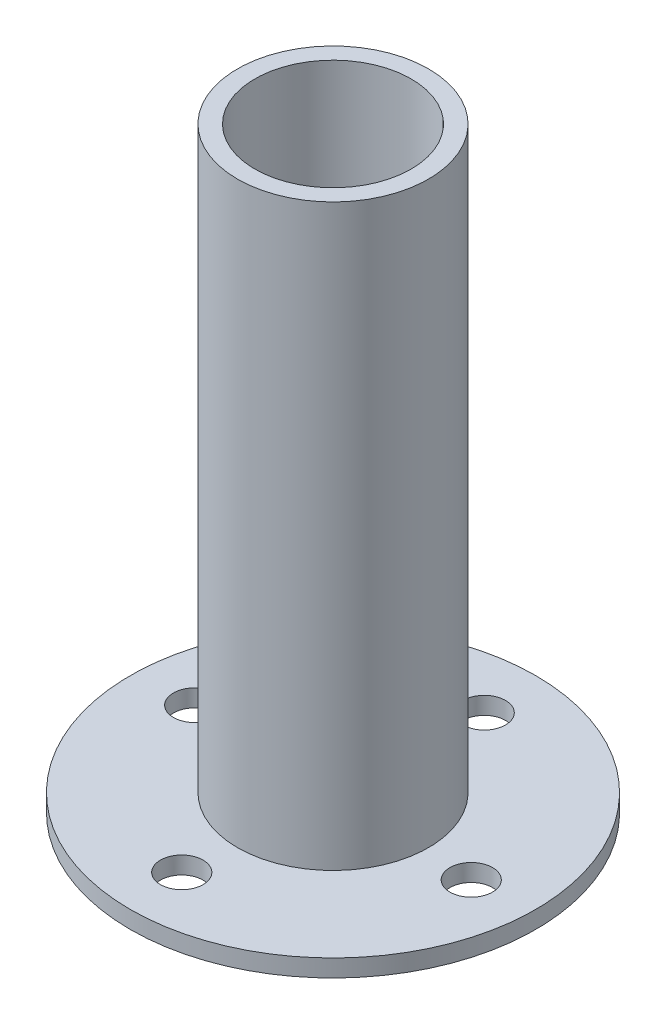
ISO-10303-21;
HEADER;
FILE_DESCRIPTION(('STEP AP214'),'2;1');
FILE_NAME('part.step','',(''),(''),'','','');
FILE_SCHEMA(('AUTOMOTIVE_DESIGN { 1 0 10303 214 1 1 1 1 }'));
ENDSEC;
DATA;
#1=APPLICATION_CONTEXT('core data for automotive mechanical design processes');
#2=APPLICATION_PROTOCOL_DEFINITION('international standard','automotive_design',2000,#1);
#3=PRODUCT_CONTEXT('',#1,'mechanical');
#4=PRODUCT('Part','Part','',(#3));
#5=PRODUCT_RELATED_PRODUCT_CATEGORY('part','',(#4));
#6=PRODUCT_DEFINITION_FORMATION('','',#4);
#7=PRODUCT_DEFINITION_CONTEXT('part definition',#1,'design');
#8=PRODUCT_DEFINITION('design','',#6,#7);
#9=PRODUCT_DEFINITION_SHAPE('','',#8);
#10=(LENGTH_UNIT() NAMED_UNIT(*) SI_UNIT(.MILLI.,.METRE.));
#11=(NAMED_UNIT(*) PLANE_ANGLE_UNIT() SI_UNIT($,.RADIAN.));
#12=(NAMED_UNIT(*) SI_UNIT($,.STERADIAN.) SOLID_ANGLE_UNIT());
#13=UNCERTAINTY_MEASURE_WITH_UNIT(LENGTH_MEASURE(1.E-05),#10,'distance_accuracy_value','');
#14=(GEOMETRIC_REPRESENTATION_CONTEXT(3) GLOBAL_UNCERTAINTY_ASSIGNED_CONTEXT((#13)) GLOBAL_UNIT_ASSIGNED_CONTEXT((#10,
#11,#12)) REPRESENTATION_CONTEXT('',''));
#15=CARTESIAN_POINT('',(0.,0.,0.));
#16=DIRECTION('',(0.,0.,1.));
#17=DIRECTION('',(1.,0.,0.));
#18=AXIS2_PLACEMENT_3D('',#15,#16,#17);
#19=CARTESIAN_POINT('',(0.,103.,0.));
#20=DIRECTION('',(0.,1.,0.));
#21=DIRECTION('',(0.,0.,1.));
#22=AXIS2_PLACEMENT_3D('',#19,#20,#21);
#23=PLANE('',#22);
#24=CARTESIAN_POINT('',(0.,103.,0.));
#25=DIRECTION('',(0.,1.,0.));
#26=DIRECTION('',(0.,0.,1.));
#27=AXIS2_PLACEMENT_3D('',#24,#25,#26);
#28=CIRCLE('',#27,16.5);
#29=CARTESIAN_POINT('',(0.,103.,16.5));
#30=VERTEX_POINT('',#29);
#31=EDGE_CURVE('E12',#30,#30,#28,.T.);
#32=ORIENTED_EDGE('',*,*,#31,.T.);
#33=EDGE_LOOP('',(#32));
#34=FACE_BOUND('',#33,.T.);
#35=CARTESIAN_POINT('',(0.,103.,0.));
#36=DIRECTION('',(0.,1.,0.));
#37=DIRECTION('',(1.,0.,0.));
#38=AXIS2_PLACEMENT_3D('',#35,#36,#37);
#39=CIRCLE('',#38,13.5);
#40=CARTESIAN_POINT('',(13.5,103.,0.));
#41=VERTEX_POINT('',#40);
#42=EDGE_CURVE('E57',#41,#41,#39,.T.);
#43=ORIENTED_EDGE('',*,*,#42,.F.);
#44=EDGE_LOOP('',(#43));
#45=FACE_BOUND('',#44,.T.);
#46=ADVANCED_FACE('F46',(#34,#45),#23,.T.);
#47=CARTESIAN_POINT('',(0.,3.,0.));
#48=DIRECTION('',(0.,1.,0.));
#49=DIRECTION('',(0.,0.,1.));
#50=AXIS2_PLACEMENT_3D('',#47,#48,#49);
#51=PLANE('',#50);
#52=CARTESIAN_POINT('',(0.,3.,0.));
#53=DIRECTION('',(0.,1.,0.));
#54=DIRECTION('',(0.,0.,1.));
#55=AXIS2_PLACEMENT_3D('',#52,#53,#54);
#56=CIRCLE('',#55,16.5);
#57=CARTESIAN_POINT('',(0.,3.,16.5));
#58=VERTEX_POINT('',#57);
#59=EDGE_CURVE('E50',#58,#58,#56,.T.);
#60=ORIENTED_EDGE('',*,*,#59,.F.);
#61=EDGE_LOOP('',(#60));
#62=FACE_BOUND('',#61,.T.);
#63=CARTESIAN_POINT('',(0.,3.,0.));
#64=DIRECTION('',(0.,1.,0.));
#65=DIRECTION('',(1.,0.,0.));
#66=AXIS2_PLACEMENT_3D('',#63,#64,#65);
#67=CIRCLE('',#66,13.5);
#68=CARTESIAN_POINT('',(13.5,3.,0.));
#69=VERTEX_POINT('',#68);
#70=EDGE_CURVE('E59',#69,#69,#67,.T.);
#71=ORIENTED_EDGE('',*,*,#70,.T.);
#72=EDGE_LOOP('',(#71));
#73=FACE_BOUND('',#72,.T.);
#74=ADVANCED_FACE('F69',(#62,#73),#51,.F.);
#75=CARTESIAN_POINT('',(0.,103.,0.));
#76=DIRECTION('',(0.,-1.,0.));
#77=DIRECTION('',(0.,0.,-1.));
#78=AXIS2_PLACEMENT_3D('',#75,#76,#77);
#79=CYLINDRICAL_SURFACE('',#78,16.5);
#80=ORIENTED_EDGE('',*,*,#31,.F.);
#81=EDGE_LOOP('',(#80));
#82=FACE_BOUND('',#81,.T.);
#83=ORIENTED_EDGE('',*,*,#59,.T.);
#84=EDGE_LOOP('',(#83));
#85=FACE_BOUND('',#84,.T.);
#86=ADVANCED_FACE('F48',(#82,#85),#79,.T.);
#87=CARTESIAN_POINT('',(0.,103.,0.));
#88=DIRECTION('',(0.,-1.,0.));
#89=DIRECTION('',(0.,0.,-1.));
#90=AXIS2_PLACEMENT_3D('',#87,#88,#89);
#91=CYLINDRICAL_SURFACE('',#90,13.5);
#92=ORIENTED_EDGE('',*,*,#42,.T.);
#93=EDGE_LOOP('',(#92));
#94=FACE_BOUND('',#93,.T.);
#95=ORIENTED_EDGE('',*,*,#70,.F.);
#96=EDGE_LOOP('',(#95));
#97=FACE_BOUND('',#96,.T.);
#98=ADVANCED_FACE('F65',(#94,#97),#91,.F.);
#99=CLOSED_SHELL('',(#46,#74,#86,#98));
#100=MANIFOLD_SOLID_BREP('B2',#99);
#101=CARTESIAN_POINT('',(0.,3.,0.));
#102=DIRECTION('',(0.,-1.,0.));
#103=DIRECTION('',(0.,0.,-1.));
#104=AXIS2_PLACEMENT_3D('',#101,#102,#103);
#105=CYLINDRICAL_SURFACE('',#104,35.);
#106=CARTESIAN_POINT('',(0.,3.,0.));
#107=DIRECTION('',(0.,1.,0.));
#108=DIRECTION('',(0.,0.,1.));
#109=AXIS2_PLACEMENT_3D('',#106,#107,#108);
#110=CIRCLE('',#109,35.);
#111=CARTESIAN_POINT('',(0.,3.,35.));
#112=VERTEX_POINT('',#111);
#113=EDGE_CURVE('E45',#112,#112,#110,.T.);
#114=ORIENTED_EDGE('',*,*,#113,.F.);
#115=EDGE_LOOP('',(#114));
#116=FACE_BOUND('',#115,.T.);
#117=CARTESIAN_POINT('',(0.,0.,0.));
#118=DIRECTION('',(0.,1.,0.));
#119=DIRECTION('',(0.,0.,1.));
#120=AXIS2_PLACEMENT_3D('',#117,#118,#119);
#121=CIRCLE('',#120,35.);
#122=CARTESIAN_POINT('',(0.,0.,35.));
#123=VERTEX_POINT('',#122);
#124=EDGE_CURVE('E114',#123,#123,#121,.T.);
#125=ORIENTED_EDGE('',*,*,#124,.T.);
#126=EDGE_LOOP('',(#125));
#127=FACE_BOUND('',#126,.T.);
#128=ADVANCED_FACE('F107',(#116,#127),#105,.T.);
#129=CARTESIAN_POINT('',(0.,3.,0.));
#130=DIRECTION('',(0.,1.,0.));
#131=DIRECTION('',(0.,0.,1.));
#132=AXIS2_PLACEMENT_3D('',#129,#130,#131);
#133=PLANE('',#132);
#134=CARTESIAN_POINT('',(-25.,3.,-1.1194572837587));
#135=DIRECTION('',(0.,1.,0.));
#136=DIRECTION('',(1.,0.,0.));
#137=AXIS2_PLACEMENT_3D('',#134,#135,#136);
#138=CIRCLE('',#137,3.67612406468724);
#139=CARTESIAN_POINT('',(-21.3238759353128,3.,-1.11945728375871));
#140=VERTEX_POINT('',#139);
#141=EDGE_CURVE('E134',#140,#140,#138,.T.);
#142=ORIENTED_EDGE('',*,*,#141,.F.);
#143=EDGE_LOOP('',(#142));
#144=FACE_BOUND('',#143,.T.);
#145=CARTESIAN_POINT('',(-1.11945728375878,3.,25.));
#146=DIRECTION('',(0.,1.,0.));
#147=DIRECTION('',(0.,0.,-1.));
#148=AXIS2_PLACEMENT_3D('',#145,#146,#147);
#149=CIRCLE('',#148,3.67612406468724);
#150=CARTESIAN_POINT('',(-1.11945728375878,3.,21.3238759353128));
#151=VERTEX_POINT('',#150);
#152=EDGE_CURVE('E148',#151,#151,#149,.T.);
#153=ORIENTED_EDGE('',*,*,#152,.F.);
#154=EDGE_LOOP('',(#153));
#155=FACE_BOUND('',#154,.T.);
#156=CARTESIAN_POINT('',(25.,3.,1.11945728375852));
#157=DIRECTION('',(0.,1.,0.));
#158=DIRECTION('',(-1.,0.,0.));
#159=AXIS2_PLACEMENT_3D('',#156,#157,#158);
#160=CIRCLE('',#159,3.67612406468724);
#161=CARTESIAN_POINT('',(21.3238759353128,3.,1.11945728375856));
#162=VERTEX_POINT('',#161);
#163=EDGE_CURVE('E145',#162,#162,#160,.T.);
#164=ORIENTED_EDGE('',*,*,#163,.F.);
#165=EDGE_LOOP('',(#164));
#166=FACE_BOUND('',#165,.T.);
#167=CARTESIAN_POINT('',(1.11945728375878,3.,-25.));
#168=DIRECTION('',(0.,1.,0.));
#169=DIRECTION('',(0.,0.,1.));
#170=AXIS2_PLACEMENT_3D('',#167,#168,#169);
#171=CIRCLE('',#170,3.67612406468724);
#172=CARTESIAN_POINT('',(1.11945728375878,3.,-21.3238759353128));
#173=VERTEX_POINT('',#172);
#174=EDGE_CURVE('E130',#173,#173,#171,.T.);
#175=ORIENTED_EDGE('',*,*,#174,.F.);
#176=EDGE_LOOP('',(#175));
#177=FACE_BOUND('',#176,.T.);
#178=CARTESIAN_POINT('',(0.,3.,0.));
#179=DIRECTION('',(0.,1.,0.));
#180=DIRECTION('',(0.,0.,1.));
#181=AXIS2_PLACEMENT_3D('',#178,#179,#180);
#182=CIRCLE('',#181,14.);
#183=CARTESIAN_POINT('',(0.,3.,14.));
#184=VERTEX_POINT('',#183);
#185=EDGE_CURVE('E122',#184,#184,#182,.T.);
#186=ORIENTED_EDGE('',*,*,#185,.F.);
#187=EDGE_LOOP('',(#186));
#188=FACE_BOUND('',#187,.T.);
#189=ORIENTED_EDGE('',*,*,#113,.T.);
#190=EDGE_LOOP('',(#189));
#191=FACE_BOUND('',#190,.T.);
#192=ADVANCED_FACE('F157',(#144,#155,#166,#177,#188,#191),#133,.T.);
#193=CARTESIAN_POINT('',(0.,0.,0.));
#194=DIRECTION('',(0.,1.,0.));
#195=DIRECTION('',(0.,0.,1.));
#196=AXIS2_PLACEMENT_3D('',#193,#194,#195);
#197=PLANE('',#196);
#198=CARTESIAN_POINT('',(-25.,0.,-1.1194572837587));
#199=DIRECTION('',(0.,1.,0.));
#200=DIRECTION('',(0.,0.,1.));
#201=AXIS2_PLACEMENT_3D('',#198,#199,#200);
#202=CIRCLE('',#201,3.67612406468724);
#203=CARTESIAN_POINT('',(-25.,0.,2.55666678092855));
#204=VERTEX_POINT('',#203);
#205=EDGE_CURVE('E110',#204,#204,#202,.T.);
#206=ORIENTED_EDGE('',*,*,#205,.T.);
#207=EDGE_LOOP('',(#206));
#208=FACE_BOUND('',#207,.T.);
#209=CARTESIAN_POINT('',(-1.11945728375878,0.,25.));
#210=DIRECTION('',(0.,1.,0.));
#211=DIRECTION('',(0.,0.,1.));
#212=AXIS2_PLACEMENT_3D('',#209,#210,#211);
#213=CIRCLE('',#212,3.67612406468724);
#214=CARTESIAN_POINT('',(-1.11945728375878,0.,28.6761240646872));
#215=VERTEX_POINT('',#214);
#216=EDGE_CURVE('E133',#215,#215,#213,.T.);
#217=ORIENTED_EDGE('',*,*,#216,.T.);
#218=EDGE_LOOP('',(#217));
#219=FACE_BOUND('',#218,.T.);
#220=CARTESIAN_POINT('',(25.,0.,1.11945728375852));
#221=DIRECTION('',(0.,1.,0.));
#222=DIRECTION('',(0.,0.,1.));
#223=AXIS2_PLACEMENT_3D('',#220,#221,#222);
#224=CIRCLE('',#223,3.67612406468724);
#225=CARTESIAN_POINT('',(25.,0.,4.79558134844577));
#226=VERTEX_POINT('',#225);
#227=EDGE_CURVE('E131',#226,#226,#224,.T.);
#228=ORIENTED_EDGE('',*,*,#227,.T.);
#229=EDGE_LOOP('',(#228));
#230=FACE_BOUND('',#229,.T.);
#231=CARTESIAN_POINT('',(1.11945728375878,0.,-25.));
#232=DIRECTION('',(0.,1.,0.));
#233=DIRECTION('',(0.,0.,1.));
#234=AXIS2_PLACEMENT_3D('',#231,#232,#233);
#235=CIRCLE('',#234,3.67612406468724);
#236=CARTESIAN_POINT('',(1.11945728375878,0.,-21.3238759353128));
#237=VERTEX_POINT('',#236);
#238=EDGE_CURVE('E127',#237,#237,#235,.T.);
#239=ORIENTED_EDGE('',*,*,#238,.T.);
#240=EDGE_LOOP('',(#239));
#241=FACE_BOUND('',#240,.T.);
#242=CARTESIAN_POINT('',(0.,0.,0.));
#243=DIRECTION('',(0.,1.,0.));
#244=DIRECTION('',(0.,0.,1.));
#245=AXIS2_PLACEMENT_3D('',#242,#243,#244);
#246=CIRCLE('',#245,14.);
#247=CARTESIAN_POINT('',(0.,0.,14.));
#248=VERTEX_POINT('',#247);
#249=EDGE_CURVE('E119',#248,#248,#246,.T.);
#250=ORIENTED_EDGE('',*,*,#249,.T.);
#251=EDGE_LOOP('',(#250));
#252=FACE_BOUND('',#251,.T.);
#253=ORIENTED_EDGE('',*,*,#124,.F.);
#254=EDGE_LOOP('',(#253));
#255=FACE_BOUND('',#254,.T.);
#256=ADVANCED_FACE('F160',(#208,#219,#230,#241,#252,#255),#197,.F.);
#257=CARTESIAN_POINT('',(0.,-3.,0.));
#258=DIRECTION('',(0.,1.,0.));
#259=DIRECTION('',(0.,0.,1.));
#260=AXIS2_PLACEMENT_3D('',#257,#258,#259);
#261=CYLINDRICAL_SURFACE('',#260,14.);
#262=ORIENTED_EDGE('',*,*,#185,.T.);
#263=EDGE_LOOP('',(#262));
#264=FACE_BOUND('',#263,.T.);
#265=ORIENTED_EDGE('',*,*,#249,.F.);
#266=EDGE_LOOP('',(#265));
#267=FACE_BOUND('',#266,.T.);
#268=ADVANCED_FACE('F170',(#264,#267),#261,.F.);
#269=CARTESIAN_POINT('',(1.11945728375878,-3.,-25.));
#270=DIRECTION('',(0.,1.,0.));
#271=DIRECTION('',(0.,0.,1.));
#272=AXIS2_PLACEMENT_3D('',#269,#270,#271);
#273=CYLINDRICAL_SURFACE('',#272,3.67612406468724);
#274=ORIENTED_EDGE('',*,*,#174,.T.);
#275=EDGE_LOOP('',(#274));
#276=FACE_BOUND('',#275,.T.);
#277=ORIENTED_EDGE('',*,*,#238,.F.);
#278=EDGE_LOOP('',(#277));
#279=FACE_BOUND('',#278,.T.);
#280=ADVANCED_FACE('F173',(#276,#279),#273,.F.);
#281=CARTESIAN_POINT('',(25.,-3.,1.11945728375852));
#282=DIRECTION('',(0.,1.,0.));
#283=DIRECTION('',(0.,0.,1.));
#284=AXIS2_PLACEMENT_3D('',#281,#282,#283);
#285=CYLINDRICAL_SURFACE('',#284,3.67612406468724);
#286=ORIENTED_EDGE('',*,*,#163,.T.);
#287=EDGE_LOOP('',(#286));
#288=FACE_BOUND('',#287,.T.);
#289=ORIENTED_EDGE('',*,*,#227,.F.);
#290=EDGE_LOOP('',(#289));
#291=FACE_BOUND('',#290,.T.);
#292=ADVANCED_FACE('F204',(#288,#291),#285,.F.);
#293=CARTESIAN_POINT('',(-1.11945728375878,-3.,25.));
#294=DIRECTION('',(0.,1.,0.));
#295=DIRECTION('',(0.,0.,1.));
#296=AXIS2_PLACEMENT_3D('',#293,#294,#295);
#297=CYLINDRICAL_SURFACE('',#296,3.67612406468724);
#298=ORIENTED_EDGE('',*,*,#152,.T.);
#299=EDGE_LOOP('',(#298));
#300=FACE_BOUND('',#299,.T.);
#301=ORIENTED_EDGE('',*,*,#216,.F.);
#302=EDGE_LOOP('',(#301));
#303=FACE_BOUND('',#302,.T.);
#304=ADVANCED_FACE('F210',(#300,#303),#297,.F.);
#305=CARTESIAN_POINT('',(-25.,-3.,-1.1194572837587));
#306=DIRECTION('',(0.,1.,0.));
#307=DIRECTION('',(0.,0.,1.));
#308=AXIS2_PLACEMENT_3D('',#305,#306,#307);
#309=CYLINDRICAL_SURFACE('',#308,3.67612406468724);
#310=ORIENTED_EDGE('',*,*,#141,.T.);
#311=EDGE_LOOP('',(#310));
#312=FACE_BOUND('',#311,.T.);
#313=ORIENTED_EDGE('',*,*,#205,.F.);
#314=EDGE_LOOP('',(#313));
#315=FACE_BOUND('',#314,.T.);
#316=ADVANCED_FACE('F154',(#312,#315),#309,.F.);
#317=CLOSED_SHELL('',(#128,#192,#256,#268,#280,#292,#304,#316));
#318=MANIFOLD_SOLID_BREP('B7',#317);
#319=ADVANCED_BREP_SHAPE_REPRESENTATION('',(#18,#100,#318),#14);
#320=SHAPE_DEFINITION_REPRESENTATION(#9,#319);
ENDSEC;
END-ISO-10303-21;
